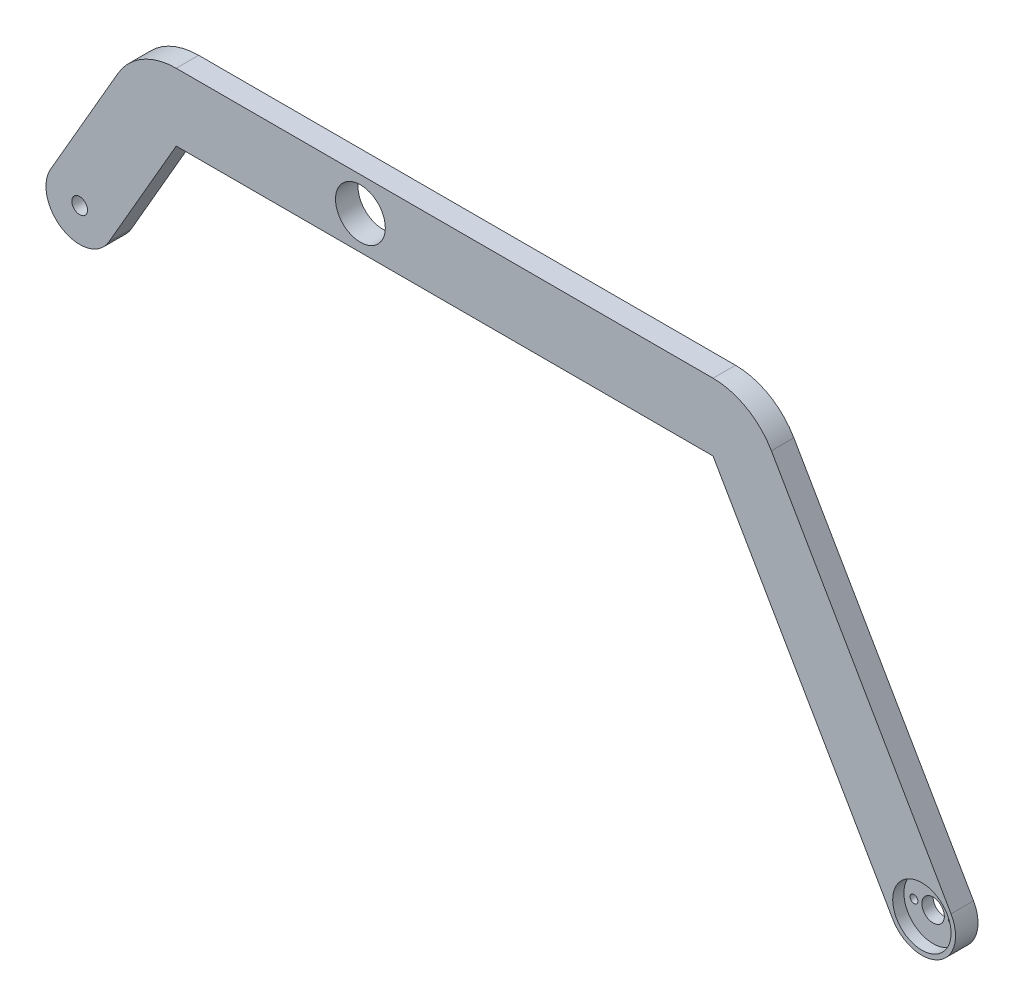
ISO-10303-21;
HEADER;
FILE_DESCRIPTION(('STEP AP214'),'2;1');
FILE_NAME('part.step','',(''),(''),'','','');
FILE_SCHEMA(('AUTOMOTIVE_DESIGN { 1 0 10303 214 1 1 1 1 }'));
ENDSEC;
DATA;
#1=APPLICATION_CONTEXT('core data for automotive mechanical design processes');
#2=APPLICATION_PROTOCOL_DEFINITION('international standard','automotive_design',2000,#1);
#3=PRODUCT_CONTEXT('',#1,'mechanical');
#4=PRODUCT('Part','Part','',(#3));
#5=PRODUCT_RELATED_PRODUCT_CATEGORY('part','',(#4));
#6=PRODUCT_DEFINITION_FORMATION('','',#4);
#7=PRODUCT_DEFINITION_CONTEXT('part definition',#1,'design');
#8=PRODUCT_DEFINITION('design','',#6,#7);
#9=PRODUCT_DEFINITION_SHAPE('','',#8);
#10=(LENGTH_UNIT() NAMED_UNIT(*) SI_UNIT(.MILLI.,.METRE.));
#11=(NAMED_UNIT(*) PLANE_ANGLE_UNIT() SI_UNIT($,.RADIAN.));
#12=(NAMED_UNIT(*) SI_UNIT($,.STERADIAN.) SOLID_ANGLE_UNIT());
#13=UNCERTAINTY_MEASURE_WITH_UNIT(LENGTH_MEASURE(1.E-05),#10,'distance_accuracy_value','');
#14=(GEOMETRIC_REPRESENTATION_CONTEXT(3) GLOBAL_UNCERTAINTY_ASSIGNED_CONTEXT((#13)) GLOBAL_UNIT_ASSIGNED_CONTEXT((#10,
#11,#12)) REPRESENTATION_CONTEXT('',''));
#15=CARTESIAN_POINT('',(0.,0.,0.));
#16=DIRECTION('',(0.,0.,1.));
#17=DIRECTION('',(1.,0.,0.));
#18=AXIS2_PLACEMENT_3D('',#15,#16,#17);
#19=CARTESIAN_POINT('',(258.499974642121,-146.043302059951,-10.));
#20=DIRECTION('',(0.,0.,1.));
#21=DIRECTION('',(-1.,0.,0.));
#22=AXIS2_PLACEMENT_3D('',#19,#20,#21);
#23=CYLINDRICAL_SURFACE('',#22,1.74999999999998);
#24=CARTESIAN_POINT('',(258.499974642121,-146.043302059951,-10.));
#25=DIRECTION('',(0.,0.,1.));
#26=DIRECTION('',(1.,0.,0.));
#27=AXIS2_PLACEMENT_3D('',#24,#25,#26);
#28=CIRCLE('',#27,1.74999999999998);
#29=CARTESIAN_POINT('',(260.249974642121,-146.043302059951,-10.));
#30=VERTEX_POINT('',#29);
#31=EDGE_CURVE('E157',#30,#30,#28,.T.);
#32=ORIENTED_EDGE('',*,*,#31,.F.);
#33=EDGE_LOOP('',(#32));
#34=FACE_BOUND('',#33,.T.);
#35=CARTESIAN_POINT('',(258.499974642121,-146.043302059951,-5.));
#36=DIRECTION('',(0.,0.,-1.));
#37=DIRECTION('',(-1.,0.,0.));
#38=AXIS2_PLACEMENT_3D('',#35,#36,#37);
#39=CIRCLE('',#38,1.74999999999998);
#40=CARTESIAN_POINT('',(256.749974642121,-146.043302059951,-5.));
#41=VERTEX_POINT('',#40);
#42=EDGE_CURVE('E202',#41,#41,#39,.T.);
#43=ORIENTED_EDGE('',*,*,#42,.F.);
#44=EDGE_LOOP('',(#43));
#45=FACE_BOUND('',#44,.T.);
#46=ADVANCED_FACE('F43',(#34,#45),#23,.F.);
#47=CARTESIAN_POINT('',(241.500025357879,-146.084827151071,-10.));
#48=DIRECTION('',(0.,0.,1.));
#49=DIRECTION('',(-1.,0.,0.));
#50=AXIS2_PLACEMENT_3D('',#47,#48,#49);
#51=CYLINDRICAL_SURFACE('',#50,1.75000000000004);
#52=CARTESIAN_POINT('',(241.500025357879,-146.084827151071,-10.));
#53=DIRECTION('',(0.,0.,1.));
#54=DIRECTION('',(1.,0.,0.));
#55=AXIS2_PLACEMENT_3D('',#52,#53,#54);
#56=CIRCLE('',#55,1.75000000000004);
#57=CARTESIAN_POINT('',(243.250025357879,-146.084827151071,-10.));
#58=VERTEX_POINT('',#57);
#59=EDGE_CURVE('E220',#58,#58,#56,.T.);
#60=ORIENTED_EDGE('',*,*,#59,.F.);
#61=EDGE_LOOP('',(#60));
#62=FACE_BOUND('',#61,.T.);
#63=CARTESIAN_POINT('',(241.500025357879,-146.084827151071,-5.));
#64=DIRECTION('',(0.,0.,-1.));
#65=DIRECTION('',(-1.,0.,0.));
#66=AXIS2_PLACEMENT_3D('',#63,#64,#65);
#67=CIRCLE('',#66,1.75000000000004);
#68=CARTESIAN_POINT('',(239.750025357879,-146.084827151071,-5.));
#69=VERTEX_POINT('',#68);
#70=EDGE_CURVE('E197',#69,#69,#67,.T.);
#71=ORIENTED_EDGE('',*,*,#70,.F.);
#72=EDGE_LOOP('',(#71));
#73=FACE_BOUND('',#72,.T.);
#74=ADVANCED_FACE('F272',(#62,#73),#51,.F.);
#75=CARTESIAN_POINT('',(250.,-146.064064605511,31.3601857456234));
#76=DIRECTION('',(0.,0.,-1.));
#77=DIRECTION('',(1.,0.,0.));
#78=AXIS2_PLACEMENT_3D('',#75,#76,#77);
#79=CYLINDRICAL_SURFACE('',#78,4.99999999999999);
#80=CARTESIAN_POINT('',(250.,-146.064064605511,-10.));
#81=DIRECTION('',(0.,0.,1.));
#82=DIRECTION('',(1.,0.,0.));
#83=AXIS2_PLACEMENT_3D('',#80,#81,#82);
#84=CIRCLE('',#83,4.99999999999999);
#85=CARTESIAN_POINT('',(255.,-146.064064605511,-10.));
#86=VERTEX_POINT('',#85);
#87=EDGE_CURVE('E217',#86,#86,#84,.T.);
#88=ORIENTED_EDGE('',*,*,#87,.F.);
#89=EDGE_LOOP('',(#88));
#90=FACE_BOUND('',#89,.T.);
#91=CARTESIAN_POINT('',(250.,-146.064064605511,-5.));
#92=DIRECTION('',(0.,0.,-1.));
#93=DIRECTION('',(-1.,0.,0.));
#94=AXIS2_PLACEMENT_3D('',#91,#92,#93);
#95=CIRCLE('',#94,4.99999999999999);
#96=CARTESIAN_POINT('',(245.,-146.064064605511,-5.));
#97=VERTEX_POINT('',#96);
#98=EDGE_CURVE('E195',#97,#97,#95,.F.);
#99=ORIENTED_EDGE('',*,*,#98,.T.);
#100=EDGE_LOOP('',(#99));
#101=FACE_BOUND('',#100,.T.);
#102=ADVANCED_FACE('F278',(#90,#101),#79,.F.);
#103=CARTESIAN_POINT('',(-82.0096189432334,-15.,-10.));
#104=DIRECTION('',(0.,0.,1.));
#105=DIRECTION('',(-1.,0.,0.));
#106=AXIS2_PLACEMENT_3D('',#103,#104,#105);
#107=PLANE('',#106);
#108=CARTESIAN_POINT('',(-125.,-59.4615242270661,-10.));
#109=DIRECTION('',(0.,0.,-1.));
#110=DIRECTION('',(-1.,0.,0.));
#111=AXIS2_PLACEMENT_3D('',#108,#109,#110);
#112=CIRCLE('',#111,7.50000000000001);
#113=CARTESIAN_POINT('',(-132.5,-59.4615242270661,-10.));
#114=VERTEX_POINT('',#113);
#115=EDGE_CURVE('E12',#114,#114,#112,.F.);
#116=ORIENTED_EDGE('',*,*,#115,.T.);
#117=EDGE_LOOP('',(#116));
#118=FACE_BOUND('',#117,.T.);
#119=ORIENTED_EDGE('',*,*,#87,.T.);
#120=EDGE_LOOP('',(#119));
#121=FACE_BOUND('',#120,.T.);
#122=CARTESIAN_POINT('',(0.,0.,-10.));
#123=DIRECTION('',(0.,0.,1.));
#124=DIRECTION('',(1.,0.,0.));
#125=AXIS2_PLACEMENT_3D('',#122,#123,#124);
#126=CIRCLE('',#125,11.0875);
#127=CARTESIAN_POINT('',(11.0875,0.,-10.));
#128=VERTEX_POINT('',#127);
#129=EDGE_CURVE('E221',#128,#128,#126,.T.);
#130=ORIENTED_EDGE('',*,*,#129,.T.);
#131=EDGE_LOOP('',(#130));
#132=FACE_BOUND('',#131,.T.);
#133=DIRECTION('',(-1.,0.,0.));
#134=VECTOR('',#133,1.);
#135=CARTESIAN_POINT('',(0.,15.,-10.));
#136=LINE('',#135,#134);
#137=CARTESIAN_POINT('',(157.009618943233,15.,-10.));
#138=VERTEX_POINT('',#137);
#139=CARTESIAN_POINT('',(-82.0096189432334,15.,-10.));
#140=VERTEX_POINT('',#139);
#141=EDGE_CURVE('E181',#138,#140,#136,.T.);
#142=ORIENTED_EDGE('',*,*,#141,.F.);
#143=CARTESIAN_POINT('',(157.009618943233,-15.,-10.));
#144=DIRECTION('',(0.,0.,1.));
#145=DIRECTION('',(1.,0.,0.));
#146=AXIS2_PLACEMENT_3D('',#143,#144,#145);
#147=CIRCLE('',#146,30.);
#148=CARTESIAN_POINT('',(182.990381056766,0.,-10.));
#149=VERTEX_POINT('',#148);
#150=EDGE_CURVE('E148',#149,#138,#147,.T.);
#151=ORIENTED_EDGE('',*,*,#150,.F.);
#152=DIRECTION('',(-0.5,0.866025403784438,0.));
#153=VECTOR('',#152,1.);
#154=CARTESIAN_POINT('',(262.990381056767,-138.564064605511,-10.));
#155=LINE('',#154,#153);
#156=CARTESIAN_POINT('',(262.990381056767,-138.564064605511,-10.));
#157=VERTEX_POINT('',#156);
#158=EDGE_CURVE('E128',#157,#149,#155,.T.);
#159=ORIENTED_EDGE('',*,*,#158,.F.);
#160=CARTESIAN_POINT('',(250.,-146.064064605511,-10.));
#161=DIRECTION('',(0.,0.,1.));
#162=DIRECTION('',(1.,0.,0.));
#163=AXIS2_PLACEMENT_3D('',#160,#161,#162);
#164=CIRCLE('',#163,15.);
#165=CARTESIAN_POINT('',(237.009618943233,-153.564064605511,-10.));
#166=VERTEX_POINT('',#165);
#167=EDGE_CURVE('E138',#166,#157,#164,.T.);
#168=ORIENTED_EDGE('',*,*,#167,.F.);
#169=DIRECTION('',(0.5,-0.866025403784439,0.));
#170=VECTOR('',#169,1.);
#171=CARTESIAN_POINT('',(157.009618943233,-15.,-10.));
#172=LINE('',#171,#170);
#173=CARTESIAN_POINT('',(157.009618943233,-15.,-10.));
#174=VERTEX_POINT('',#173);
#175=EDGE_CURVE('E143',#174,#166,#172,.T.);
#176=ORIENTED_EDGE('',*,*,#175,.F.);
#177=DIRECTION('',(1.,0.,0.));
#178=VECTOR('',#177,1.);
#179=CARTESIAN_POINT('',(0.,-15.,-10.));
#180=LINE('',#179,#178);
#181=CARTESIAN_POINT('',(-82.0096189432334,-15.,-10.));
#182=VERTEX_POINT('',#181);
#183=EDGE_CURVE('E242',#182,#174,#180,.T.);
#184=ORIENTED_EDGE('',*,*,#183,.F.);
#185=DIRECTION('',(0.5,0.866025403784438,0.));
#186=VECTOR('',#185,1.);
#187=CARTESIAN_POINT('',(-82.0096189432334,-15.,-10.));
#188=LINE('',#187,#186);
#189=CARTESIAN_POINT('',(-112.009618943233,-66.9615242270663,-10.));
#190=VERTEX_POINT('',#189);
#191=EDGE_CURVE('E239',#190,#182,#188,.T.);
#192=ORIENTED_EDGE('',*,*,#191,.F.);
#193=CARTESIAN_POINT('',(-125.,-59.4615242270666,-10.));
#194=DIRECTION('',(0.,0.,1.));
#195=DIRECTION('',(1.,0.,0.));
#196=AXIS2_PLACEMENT_3D('',#193,#194,#195);
#197=CIRCLE('',#196,15.);
#198=CARTESIAN_POINT('',(-137.990381056766,-51.9615242270664,-10.));
#199=VERTEX_POINT('',#198);
#200=EDGE_CURVE('E236',#199,#190,#197,.T.);
#201=ORIENTED_EDGE('',*,*,#200,.F.);
#202=DIRECTION('',(-0.5,-0.866025403784438,0.));
#203=VECTOR('',#202,1.);
#204=CARTESIAN_POINT('',(-137.990381056767,-51.9615242270663,-10.));
#205=LINE('',#204,#203);
#206=CARTESIAN_POINT('',(-107.990381056767,0.,-10.));
#207=VERTEX_POINT('',#206);
#208=EDGE_CURVE('E233',#207,#199,#205,.T.);
#209=ORIENTED_EDGE('',*,*,#208,.F.);
#210=CARTESIAN_POINT('',(-82.0096189432334,-15.,-10.));
#211=DIRECTION('',(0.,0.,1.));
#212=DIRECTION('',(-1.,0.,0.));
#213=AXIS2_PLACEMENT_3D('',#210,#211,#212);
#214=CIRCLE('',#213,30.);
#215=EDGE_CURVE('E231',#140,#207,#214,.T.);
#216=ORIENTED_EDGE('',*,*,#215,.F.);
#217=EDGE_LOOP('',(#142,#151,#159,#168,#176,#184,#192,#201,#209,#216));
#218=FACE_BOUND('',#217,.T.);
#219=ORIENTED_EDGE('',*,*,#31,.T.);
#220=EDGE_LOOP('',(#219));
#221=FACE_BOUND('',#220,.T.);
#222=ORIENTED_EDGE('',*,*,#59,.T.);
#223=EDGE_LOOP('',(#222));
#224=FACE_BOUND('',#223,.T.);
#225=ADVANCED_FACE('F146',(#118,#121,#132,#218,#221,#224),#107,.F.);
#226=CARTESIAN_POINT('',(-82.0096189432334,-15.,0.));
#227=DIRECTION('',(0.,0.,1.));
#228=DIRECTION('',(-1.,0.,0.));
#229=AXIS2_PLACEMENT_3D('',#226,#227,#228);
#230=PLANE('',#229);
#231=CARTESIAN_POINT('',(-125.,-59.4615242270661,0.));
#232=DIRECTION('',(0.,0.,1.));
#233=DIRECTION('',(1.,0.,0.));
#234=AXIS2_PLACEMENT_3D('',#231,#232,#233);
#235=CIRCLE('',#234,3.50000000000001);
#236=CARTESIAN_POINT('',(-121.5,-59.4615242270661,0.));
#237=VERTEX_POINT('',#236);
#238=EDGE_CURVE('E512',#237,#237,#235,.T.);
#239=ORIENTED_EDGE('',*,*,#238,.F.);
#240=EDGE_LOOP('',(#239));
#241=FACE_BOUND('',#240,.T.);
#242=CARTESIAN_POINT('',(250.,-146.064064605511,0.));
#243=DIRECTION('',(0.,0.,-1.));
#244=DIRECTION('',(-1.,0.,0.));
#245=AXIS2_PLACEMENT_3D('',#242,#243,#244);
#246=CIRCLE('',#245,13.);
#247=CARTESIAN_POINT('',(237.,-146.064064605511,0.));
#248=VERTEX_POINT('',#247);
#249=EDGE_CURVE('E205',#248,#248,#246,.T.);
#250=ORIENTED_EDGE('',*,*,#249,.T.);
#251=EDGE_LOOP('',(#250));
#252=FACE_BOUND('',#251,.T.);
#253=CARTESIAN_POINT('',(0.,0.,0.));
#254=DIRECTION('',(0.,0.,-1.));
#255=DIRECTION('',(-1.,0.,0.));
#256=AXIS2_PLACEMENT_3D('',#253,#254,#255);
#257=CIRCLE('',#256,11.0875);
#258=CARTESIAN_POINT('',(-11.0875,0.,0.));
#259=VERTEX_POINT('',#258);
#260=EDGE_CURVE('E216',#259,#259,#257,.F.);
#261=ORIENTED_EDGE('',*,*,#260,.F.);
#262=EDGE_LOOP('',(#261));
#263=FACE_BOUND('',#262,.T.);
#264=CARTESIAN_POINT('',(-82.0096189432334,-15.,0.));
#265=DIRECTION('',(0.,0.,1.));
#266=DIRECTION('',(-1.,0.,0.));
#267=AXIS2_PLACEMENT_3D('',#264,#265,#266);
#268=CIRCLE('',#267,30.);
#269=CARTESIAN_POINT('',(-82.0096189432334,15.,0.));
#270=VERTEX_POINT('',#269);
#271=CARTESIAN_POINT('',(-107.990381056767,0.,0.));
#272=VERTEX_POINT('',#271);
#273=EDGE_CURVE('E153',#270,#272,#268,.T.);
#274=ORIENTED_EDGE('',*,*,#273,.T.);
#275=DIRECTION('',(-0.5,-0.866025403784438,0.));
#276=VECTOR('',#275,1.);
#277=CARTESIAN_POINT('',(-137.990381056767,-51.9615242270663,0.));
#278=LINE('',#277,#276);
#279=CARTESIAN_POINT('',(-137.990381056766,-51.9615242270664,0.));
#280=VERTEX_POINT('',#279);
#281=EDGE_CURVE('E156',#272,#280,#278,.T.);
#282=ORIENTED_EDGE('',*,*,#281,.T.);
#283=CARTESIAN_POINT('',(-125.,-59.4615242270666,0.));
#284=DIRECTION('',(0.,0.,1.));
#285=DIRECTION('',(1.,0.,0.));
#286=AXIS2_PLACEMENT_3D('',#283,#284,#285);
#287=CIRCLE('',#286,15.);
#288=CARTESIAN_POINT('',(-112.009618943233,-66.9615242270663,0.));
#289=VERTEX_POINT('',#288);
#290=EDGE_CURVE('E160',#280,#289,#287,.T.);
#291=ORIENTED_EDGE('',*,*,#290,.T.);
#292=DIRECTION('',(0.5,0.866025403784438,0.));
#293=VECTOR('',#292,1.);
#294=CARTESIAN_POINT('',(-82.0096189432334,-15.,0.));
#295=LINE('',#294,#293);
#296=CARTESIAN_POINT('',(-82.0096189432334,-15.,0.));
#297=VERTEX_POINT('',#296);
#298=EDGE_CURVE('E163',#289,#297,#295,.T.);
#299=ORIENTED_EDGE('',*,*,#298,.T.);
#300=DIRECTION('',(1.,0.,0.));
#301=VECTOR('',#300,1.);
#302=CARTESIAN_POINT('',(0.,-15.,0.));
#303=LINE('',#302,#301);
#304=CARTESIAN_POINT('',(157.009618943233,-15.,0.));
#305=VERTEX_POINT('',#304);
#306=EDGE_CURVE('E166',#297,#305,#303,.T.);
#307=ORIENTED_EDGE('',*,*,#306,.T.);
#308=DIRECTION('',(0.5,-0.866025403784439,0.));
#309=VECTOR('',#308,1.);
#310=CARTESIAN_POINT('',(157.009618943233,-15.,0.));
#311=LINE('',#310,#309);
#312=CARTESIAN_POINT('',(237.009618943233,-153.564064605511,0.));
#313=VERTEX_POINT('',#312);
#314=EDGE_CURVE('E169',#305,#313,#311,.T.);
#315=ORIENTED_EDGE('',*,*,#314,.T.);
#316=CARTESIAN_POINT('',(250.,-146.064064605511,0.));
#317=DIRECTION('',(0.,0.,1.));
#318=DIRECTION('',(1.,0.,0.));
#319=AXIS2_PLACEMENT_3D('',#316,#317,#318);
#320=CIRCLE('',#319,15.);
#321=CARTESIAN_POINT('',(262.990381056767,-138.564064605511,0.));
#322=VERTEX_POINT('',#321);
#323=EDGE_CURVE('E172',#313,#322,#320,.T.);
#324=ORIENTED_EDGE('',*,*,#323,.T.);
#325=DIRECTION('',(-0.5,0.866025403784438,0.));
#326=VECTOR('',#325,1.);
#327=CARTESIAN_POINT('',(262.990381056767,-138.564064605511,0.));
#328=LINE('',#327,#326);
#329=CARTESIAN_POINT('',(182.990381056766,0.,0.));
#330=VERTEX_POINT('',#329);
#331=EDGE_CURVE('E131',#322,#330,#328,.T.);
#332=ORIENTED_EDGE('',*,*,#331,.T.);
#333=CARTESIAN_POINT('',(157.009618943233,-15.,0.));
#334=DIRECTION('',(0.,0.,1.));
#335=DIRECTION('',(1.,0.,0.));
#336=AXIS2_PLACEMENT_3D('',#333,#334,#335);
#337=CIRCLE('',#336,30.);
#338=CARTESIAN_POINT('',(157.009618943233,15.,0.));
#339=VERTEX_POINT('',#338);
#340=EDGE_CURVE('E175',#330,#339,#337,.T.);
#341=ORIENTED_EDGE('',*,*,#340,.T.);
#342=DIRECTION('',(-1.,0.,0.));
#343=VECTOR('',#342,1.);
#344=CARTESIAN_POINT('',(0.,15.,0.));
#345=LINE('',#344,#343);
#346=EDGE_CURVE('E178',#339,#270,#345,.T.);
#347=ORIENTED_EDGE('',*,*,#346,.T.);
#348=EDGE_LOOP('',(#274,#282,#291,#299,#307,#315,#324,#332,#341,#347));
#349=FACE_BOUND('',#348,.T.);
#350=ADVANCED_FACE('F264',(#241,#252,#263,#349),#230,.T.);
#351=CARTESIAN_POINT('',(-82.0096189432334,-15.,-10.));
#352=DIRECTION('',(0.,0.,1.));
#353=DIRECTION('',(-1.,0.,0.));
#354=AXIS2_PLACEMENT_3D('',#351,#352,#353);
#355=CYLINDRICAL_SURFACE('',#354,30.);
#356=ORIENTED_EDGE('',*,*,#273,.F.);
#357=DIRECTION('',(0.,0.,1.));
#358=VECTOR('',#357,1.);
#359=CARTESIAN_POINT('',(-82.0096189432334,15.,-10.));
#360=LINE('',#359,#358);
#361=EDGE_CURVE('E52',#140,#270,#360,.T.);
#362=ORIENTED_EDGE('',*,*,#361,.F.);
#363=ORIENTED_EDGE('',*,*,#215,.T.);
#364=DIRECTION('',(0.,0.,1.));
#365=VECTOR('',#364,1.);
#366=CARTESIAN_POINT('',(-107.990381056767,0.,-10.));
#367=LINE('',#366,#365);
#368=EDGE_CURVE('E193',#207,#272,#367,.T.);
#369=ORIENTED_EDGE('',*,*,#368,.T.);
#370=EDGE_LOOP('',(#356,#362,#363,#369));
#371=FACE_BOUND('',#370,.T.);
#372=ADVANCED_FACE('F45',(#371),#355,.T.);
#373=CARTESIAN_POINT('',(-137.990381056767,-51.9615242270663,-10.));
#374=DIRECTION('',(0.866025403784438,-0.5,0.));
#375=DIRECTION('',(0.5,0.866025403784438,0.));
#376=AXIS2_PLACEMENT_3D('',#373,#374,#375);
#377=PLANE('',#376);
#378=ORIENTED_EDGE('',*,*,#281,.F.);
#379=ORIENTED_EDGE('',*,*,#368,.F.);
#380=ORIENTED_EDGE('',*,*,#208,.T.);
#381=DIRECTION('',(0.,0.,1.));
#382=VECTOR('',#381,1.);
#383=CARTESIAN_POINT('',(-137.990381056766,-51.9615242270664,-10.));
#384=LINE('',#383,#382);
#385=EDGE_CURVE('E191',#199,#280,#384,.T.);
#386=ORIENTED_EDGE('',*,*,#385,.T.);
#387=EDGE_LOOP('',(#378,#379,#380,#386));
#388=FACE_BOUND('',#387,.T.);
#389=ADVANCED_FACE('F262',(#388),#377,.F.);
#390=CARTESIAN_POINT('',(-125.,-59.4615242270666,-10.));
#391=DIRECTION('',(0.,0.,1.));
#392=DIRECTION('',(-1.,0.,0.));
#393=AXIS2_PLACEMENT_3D('',#390,#391,#392);
#394=CYLINDRICAL_SURFACE('',#393,15.);
#395=ORIENTED_EDGE('',*,*,#290,.F.);
#396=ORIENTED_EDGE('',*,*,#385,.F.);
#397=ORIENTED_EDGE('',*,*,#200,.T.);
#398=DIRECTION('',(0.,0.,1.));
#399=VECTOR('',#398,1.);
#400=CARTESIAN_POINT('',(-112.009618943233,-66.9615242270663,-10.));
#401=LINE('',#400,#399);
#402=EDGE_CURVE('E189',#190,#289,#401,.T.);
#403=ORIENTED_EDGE('',*,*,#402,.T.);
#404=EDGE_LOOP('',(#395,#396,#397,#403));
#405=FACE_BOUND('',#404,.T.);
#406=ADVANCED_FACE('F258',(#405),#394,.T.);
#407=CARTESIAN_POINT('',(-82.0096189432334,-15.,-10.));
#408=DIRECTION('',(-0.866025403784439,0.5,0.));
#409=DIRECTION('',(-0.5,-0.866025403784439,0.));
#410=AXIS2_PLACEMENT_3D('',#407,#408,#409);
#411=PLANE('',#410);
#412=ORIENTED_EDGE('',*,*,#298,.F.);
#413=ORIENTED_EDGE('',*,*,#402,.F.);
#414=ORIENTED_EDGE('',*,*,#191,.T.);
#415=DIRECTION('',(0.,0.,1.));
#416=VECTOR('',#415,1.);
#417=CARTESIAN_POINT('',(-82.0096189432334,-15.,-10.));
#418=LINE('',#417,#416);
#419=EDGE_CURVE('E187',#182,#297,#418,.T.);
#420=ORIENTED_EDGE('',*,*,#419,.T.);
#421=EDGE_LOOP('',(#412,#413,#414,#420));
#422=FACE_BOUND('',#421,.T.);
#423=ADVANCED_FACE('F255',(#422),#411,.F.);
#424=CARTESIAN_POINT('',(0.,-15.,-10.));
#425=DIRECTION('',(0.,1.,0.));
#426=DIRECTION('',(-1.,0.,0.));
#427=AXIS2_PLACEMENT_3D('',#424,#425,#426);
#428=PLANE('',#427);
#429=ORIENTED_EDGE('',*,*,#306,.F.);
#430=ORIENTED_EDGE('',*,*,#419,.F.);
#431=ORIENTED_EDGE('',*,*,#183,.T.);
#432=DIRECTION('',(0.,0.,1.));
#433=VECTOR('',#432,1.);
#434=CARTESIAN_POINT('',(157.009618943233,-15.,-10.));
#435=LINE('',#434,#433);
#436=EDGE_CURVE('E185',#174,#305,#435,.T.);
#437=ORIENTED_EDGE('',*,*,#436,.T.);
#438=EDGE_LOOP('',(#429,#430,#431,#437));
#439=FACE_BOUND('',#438,.T.);
#440=ADVANCED_FACE('F252',(#439),#428,.F.);
#441=CARTESIAN_POINT('',(157.009618943233,-15.,-10.));
#442=DIRECTION('',(0.866025403784439,0.5,0.));
#443=DIRECTION('',(-0.5,0.866025403784439,0.));
#444=AXIS2_PLACEMENT_3D('',#441,#442,#443);
#445=PLANE('',#444);
#446=ORIENTED_EDGE('',*,*,#314,.F.);
#447=ORIENTED_EDGE('',*,*,#436,.F.);
#448=ORIENTED_EDGE('',*,*,#175,.T.);
#449=DIRECTION('',(0.,0.,1.));
#450=VECTOR('',#449,1.);
#451=CARTESIAN_POINT('',(237.009618943233,-153.564064605511,-10.));
#452=LINE('',#451,#450);
#453=EDGE_CURVE('E135',#166,#313,#452,.T.);
#454=ORIENTED_EDGE('',*,*,#453,.T.);
#455=EDGE_LOOP('',(#446,#447,#448,#454));
#456=FACE_BOUND('',#455,.T.);
#457=ADVANCED_FACE('F246',(#456),#445,.F.);
#458=CARTESIAN_POINT('',(250.,-146.064064605511,-10.));
#459=DIRECTION('',(0.,0.,1.));
#460=DIRECTION('',(-1.,0.,0.));
#461=AXIS2_PLACEMENT_3D('',#458,#459,#460);
#462=CYLINDRICAL_SURFACE('',#461,15.);
#463=ORIENTED_EDGE('',*,*,#323,.F.);
#464=ORIENTED_EDGE('',*,*,#453,.F.);
#465=ORIENTED_EDGE('',*,*,#167,.T.);
#466=DIRECTION('',(0.,0.,1.));
#467=VECTOR('',#466,1.);
#468=CARTESIAN_POINT('',(262.990381056767,-138.564064605511,-10.));
#469=LINE('',#468,#467);
#470=EDGE_CURVE('E124',#157,#322,#469,.T.);
#471=ORIENTED_EDGE('',*,*,#470,.T.);
#472=EDGE_LOOP('',(#463,#464,#465,#471));
#473=FACE_BOUND('',#472,.T.);
#474=ADVANCED_FACE('F139',(#473),#462,.T.);
#475=CARTESIAN_POINT('',(262.990381056767,-138.564064605511,-10.));
#476=DIRECTION('',(-0.866025403784438,-0.5,0.));
#477=DIRECTION('',(0.5,-0.866025403784439,0.));
#478=AXIS2_PLACEMENT_3D('',#475,#476,#477);
#479=PLANE('',#478);
#480=ORIENTED_EDGE('',*,*,#331,.F.);
#481=ORIENTED_EDGE('',*,*,#470,.F.);
#482=ORIENTED_EDGE('',*,*,#158,.T.);
#483=DIRECTION('',(0.,0.,1.));
#484=VECTOR('',#483,1.);
#485=CARTESIAN_POINT('',(182.990381056766,0.,-10.));
#486=LINE('',#485,#484);
#487=EDGE_CURVE('E95',#149,#330,#486,.T.);
#488=ORIENTED_EDGE('',*,*,#487,.T.);
#489=EDGE_LOOP('',(#480,#481,#482,#488));
#490=FACE_BOUND('',#489,.T.);
#491=ADVANCED_FACE('F126',(#490),#479,.F.);
#492=CARTESIAN_POINT('',(157.009618943233,-15.,-10.));
#493=DIRECTION('',(0.,0.,1.));
#494=DIRECTION('',(-1.,0.,0.));
#495=AXIS2_PLACEMENT_3D('',#492,#493,#494);
#496=CYLINDRICAL_SURFACE('',#495,30.);
#497=ORIENTED_EDGE('',*,*,#340,.F.);
#498=ORIENTED_EDGE('',*,*,#487,.F.);
#499=ORIENTED_EDGE('',*,*,#150,.T.);
#500=DIRECTION('',(0.,0.,1.));
#501=VECTOR('',#500,1.);
#502=CARTESIAN_POINT('',(157.009618943233,15.,-10.));
#503=LINE('',#502,#501);
#504=EDGE_CURVE('E60',#138,#339,#503,.T.);
#505=ORIENTED_EDGE('',*,*,#504,.T.);
#506=EDGE_LOOP('',(#497,#498,#499,#505));
#507=FACE_BOUND('',#506,.T.);
#508=ADVANCED_FACE('F292',(#507),#496,.T.);
#509=CARTESIAN_POINT('',(0.,15.,-10.));
#510=DIRECTION('',(0.,-1.,0.));
#511=DIRECTION('',(1.,0.,0.));
#512=AXIS2_PLACEMENT_3D('',#509,#510,#511);
#513=PLANE('',#512);
#514=ORIENTED_EDGE('',*,*,#346,.F.);
#515=ORIENTED_EDGE('',*,*,#504,.F.);
#516=ORIENTED_EDGE('',*,*,#141,.T.);
#517=ORIENTED_EDGE('',*,*,#361,.T.);
#518=EDGE_LOOP('',(#514,#515,#516,#517));
#519=FACE_BOUND('',#518,.T.);
#520=ADVANCED_FACE('F288',(#519),#513,.F.);
#521=CARTESIAN_POINT('',(0.,0.,31.3601857456234));
#522=DIRECTION('',(0.,0.,-1.));
#523=DIRECTION('',(1.,0.,0.));
#524=AXIS2_PLACEMENT_3D('',#521,#522,#523);
#525=CYLINDRICAL_SURFACE('',#524,11.0875);
#526=ORIENTED_EDGE('',*,*,#129,.F.);
#527=EDGE_LOOP('',(#526));
#528=FACE_BOUND('',#527,.T.);
#529=ORIENTED_EDGE('',*,*,#260,.T.);
#530=EDGE_LOOP('',(#529));
#531=FACE_BOUND('',#530,.T.);
#532=ADVANCED_FACE('F291',(#528,#531),#525,.F.);
#533=CARTESIAN_POINT('',(-82.0096189432334,-15.,-5.));
#534=DIRECTION('',(0.,0.,1.));
#535=DIRECTION('',(-1.,0.,0.));
#536=AXIS2_PLACEMENT_3D('',#533,#534,#535);
#537=PLANE('',#536);
#538=ORIENTED_EDGE('',*,*,#42,.T.);
#539=EDGE_LOOP('',(#538));
#540=FACE_BOUND('',#539,.T.);
#541=ORIENTED_EDGE('',*,*,#70,.T.);
#542=EDGE_LOOP('',(#541));
#543=FACE_BOUND('',#542,.T.);
#544=CARTESIAN_POINT('',(250.,-146.064064605511,-5.));
#545=DIRECTION('',(0.,0.,-1.));
#546=DIRECTION('',(-1.,0.,0.));
#547=AXIS2_PLACEMENT_3D('',#544,#545,#546);
#548=CIRCLE('',#547,13.);
#549=CARTESIAN_POINT('',(237.,-146.064064605511,-5.));
#550=VERTEX_POINT('',#549);
#551=EDGE_CURVE('E198',#550,#550,#548,.F.);
#552=ORIENTED_EDGE('',*,*,#551,.T.);
#553=EDGE_LOOP('',(#552));
#554=FACE_BOUND('',#553,.T.);
#555=ORIENTED_EDGE('',*,*,#98,.F.);
#556=EDGE_LOOP('',(#555));
#557=FACE_BOUND('',#556,.T.);
#558=ADVANCED_FACE('F344',(#540,#543,#554,#557),#537,.T.);
#559=CARTESIAN_POINT('',(250.,-146.064064605511,-46.7695526217005));
#560=DIRECTION('',(0.,0.,1.));
#561=DIRECTION('',(-1.,0.,0.));
#562=AXIS2_PLACEMENT_3D('',#559,#560,#561);
#563=CYLINDRICAL_SURFACE('',#562,13.);
#564=ORIENTED_EDGE('',*,*,#551,.F.);
#565=EDGE_LOOP('',(#564));
#566=FACE_BOUND('',#565,.T.);
#567=ORIENTED_EDGE('',*,*,#249,.F.);
#568=EDGE_LOOP('',(#567));
#569=FACE_BOUND('',#568,.T.);
#570=ADVANCED_FACE('F351',(#566,#569),#563,.F.);
#571=CARTESIAN_POINT('',(-125.,-59.4615242270661,-15.));
#572=DIRECTION('',(0.,0.,1.));
#573=DIRECTION('',(-1.,0.,0.));
#574=AXIS2_PLACEMENT_3D('',#571,#572,#573);
#575=CYLINDRICAL_SURFACE('',#574,7.50000000000001);
#576=CARTESIAN_POINT('',(-125.,-59.4615242270661,-15.));
#577=DIRECTION('',(0.,0.,1.));
#578=DIRECTION('',(1.,0.,0.));
#579=AXIS2_PLACEMENT_3D('',#576,#577,#578);
#580=CIRCLE('',#579,7.50000000000001);
#581=CARTESIAN_POINT('',(-117.5,-59.4615242270661,-15.));
#582=VERTEX_POINT('',#581);
#583=EDGE_CURVE('E210',#582,#582,#580,.T.);
#584=ORIENTED_EDGE('',*,*,#583,.T.);
#585=EDGE_LOOP('',(#584));
#586=FACE_BOUND('',#585,.T.);
#587=ORIENTED_EDGE('',*,*,#115,.F.);
#588=EDGE_LOOP('',(#587));
#589=FACE_BOUND('',#588,.T.);
#590=ADVANCED_FACE('F359',(#586,#589),#575,.T.);
#591=CARTESIAN_POINT('',(-125.,-59.4615242270661,-15.));
#592=DIRECTION('',(0.,0.,-1.));
#593=DIRECTION('',(1.,0.,0.));
#594=AXIS2_PLACEMENT_3D('',#591,#592,#593);
#595=PLANE('',#594);
#596=CARTESIAN_POINT('',(-125.,-59.4615242270661,-15.));
#597=DIRECTION('',(0.,0.,1.));
#598=DIRECTION('',(1.,0.,0.));
#599=AXIS2_PLACEMENT_3D('',#596,#597,#598);
#600=CIRCLE('',#599,3.50000000000001);
#601=CARTESIAN_POINT('',(-121.5,-59.4615242270661,-15.));
#602=VERTEX_POINT('',#601);
#603=EDGE_CURVE('E515',#602,#602,#600,.T.);
#604=ORIENTED_EDGE('',*,*,#603,.T.);
#605=EDGE_LOOP('',(#604));
#606=FACE_BOUND('',#605,.T.);
#607=ORIENTED_EDGE('',*,*,#583,.F.);
#608=EDGE_LOOP('',(#607));
#609=FACE_BOUND('',#608,.T.);
#610=ADVANCED_FACE('F367',(#606,#609),#595,.T.);
#611=CARTESIAN_POINT('',(-125.,-59.4615242270661,0.));
#612=DIRECTION('',(0.,0.,-1.));
#613=DIRECTION('',(1.,0.,0.));
#614=AXIS2_PLACEMENT_3D('',#611,#612,#613);
#615=CYLINDRICAL_SURFACE('',#614,3.50000000000001);
#616=ORIENTED_EDGE('',*,*,#238,.T.);
#617=EDGE_LOOP('',(#616));
#618=FACE_BOUND('',#617,.T.);
#619=ORIENTED_EDGE('',*,*,#603,.F.);
#620=EDGE_LOOP('',(#619));
#621=FACE_BOUND('',#620,.T.);
#622=ADVANCED_FACE('F375',(#618,#621),#615,.F.);
#623=CLOSED_SHELL('',(#46,#74,#102,#225,#350,#372,#389,#406,#423,#440,#457,#474,#491,#508,#520,
#532,#558,#570,#590,#610,#622));
#624=MANIFOLD_SOLID_BREP('B2',#623);
#625=ADVANCED_BREP_SHAPE_REPRESENTATION('',(#18,#624),#14);
#626=SHAPE_DEFINITION_REPRESENTATION(#9,#625);
ENDSEC;
END-ISO-10303-21;
